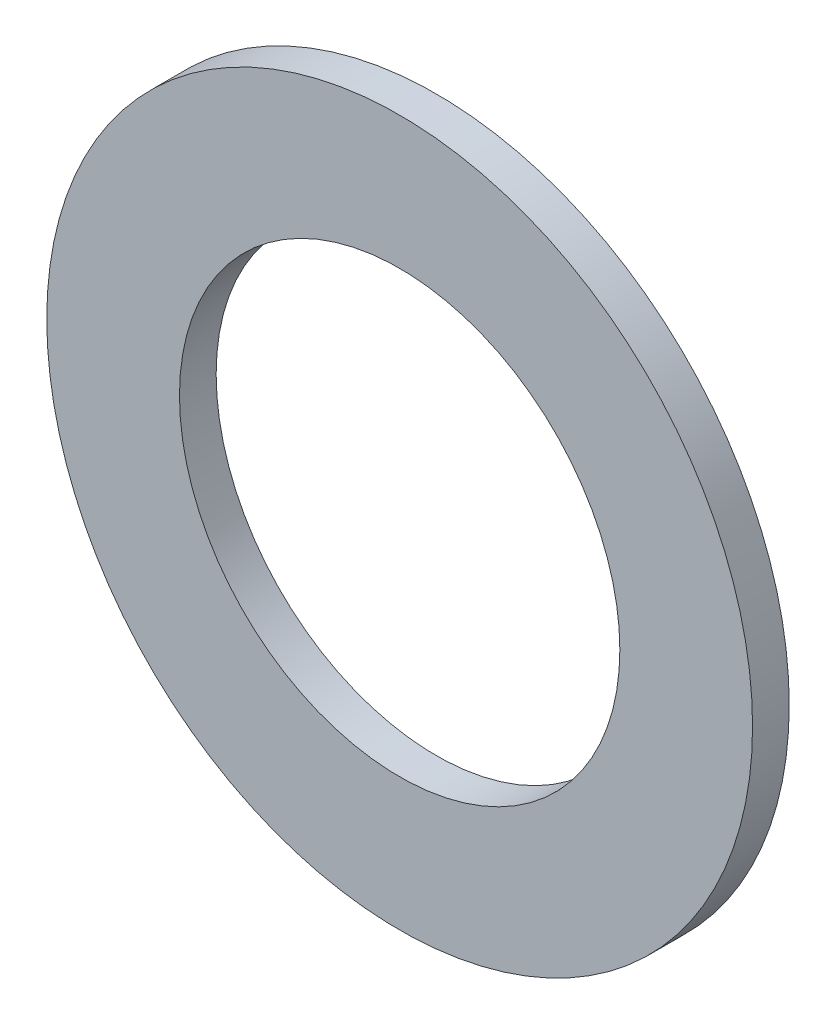
ISO-10303-21;
HEADER;
FILE_DESCRIPTION(('STEP AP214'),'2;1');
FILE_NAME('part.step','',(''),(''),'','','');
FILE_SCHEMA(('AUTOMOTIVE_DESIGN { 1 0 10303 214 1 1 1 1 }'));
ENDSEC;
DATA;
#1=APPLICATION_CONTEXT('core data for automotive mechanical design processes');
#2=APPLICATION_PROTOCOL_DEFINITION('international standard','automotive_design',2000,#1);
#3=PRODUCT_CONTEXT('',#1,'mechanical');
#4=PRODUCT('Part','Part','',(#3));
#5=PRODUCT_RELATED_PRODUCT_CATEGORY('part','',(#4));
#6=PRODUCT_DEFINITION_FORMATION('','',#4);
#7=PRODUCT_DEFINITION_CONTEXT('part definition',#1,'design');
#8=PRODUCT_DEFINITION('design','',#6,#7);
#9=PRODUCT_DEFINITION_SHAPE('','',#8);
#10=(LENGTH_UNIT() NAMED_UNIT(*) SI_UNIT(.MILLI.,.METRE.));
#11=(NAMED_UNIT(*) PLANE_ANGLE_UNIT() SI_UNIT($,.RADIAN.));
#12=(NAMED_UNIT(*) SI_UNIT($,.STERADIAN.) SOLID_ANGLE_UNIT());
#13=UNCERTAINTY_MEASURE_WITH_UNIT(LENGTH_MEASURE(1.E-05),#10,'distance_accuracy_value','');
#14=(GEOMETRIC_REPRESENTATION_CONTEXT(3) GLOBAL_UNCERTAINTY_ASSIGNED_CONTEXT((#13)) GLOBAL_UNIT_ASSIGNED_CONTEXT((#10,
#11,#12)) REPRESENTATION_CONTEXT('',''));
#15=CARTESIAN_POINT('',(0.,0.,0.));
#16=DIRECTION('',(0.,0.,1.));
#17=DIRECTION('',(1.,0.,0.));
#18=AXIS2_PLACEMENT_3D('',#15,#16,#17);
#19=CARTESIAN_POINT('',(0.,0.,0.33));
#20=DIRECTION('',(0.,0.,-1.));
#21=DIRECTION('',(-1.,0.,0.));
#22=AXIS2_PLACEMENT_3D('',#19,#20,#21);
#23=CYLINDRICAL_SURFACE('',#22,3.175);
#24=CARTESIAN_POINT('',(0.,0.,0.33));
#25=DIRECTION('',(0.,0.,-1.));
#26=DIRECTION('',(-1.,0.,0.));
#27=AXIS2_PLACEMENT_3D('',#24,#25,#26);
#28=CIRCLE('',#27,3.175);
#29=CARTESIAN_POINT('',(-3.175,0.,0.33));
#30=VERTEX_POINT('',#29);
#31=EDGE_CURVE('E19',#30,#30,#28,.F.);
#32=ORIENTED_EDGE('',*,*,#31,.F.);
#33=EDGE_LOOP('',(#32));
#34=FACE_BOUND('',#33,.T.);
#35=CARTESIAN_POINT('',(0.,0.,0.));
#36=DIRECTION('',(0.,0.,-1.));
#37=DIRECTION('',(-1.,0.,0.));
#38=AXIS2_PLACEMENT_3D('',#35,#36,#37);
#39=CIRCLE('',#38,3.175);
#40=CARTESIAN_POINT('',(-3.175,0.,0.));
#41=VERTEX_POINT('',#40);
#42=EDGE_CURVE('E28',#41,#41,#39,.F.);
#43=ORIENTED_EDGE('',*,*,#42,.T.);
#44=EDGE_LOOP('',(#43));
#45=FACE_BOUND('',#44,.T.);
#46=ADVANCED_FACE('F15',(#34,#45),#23,.T.);
#47=CARTESIAN_POINT('',(-3.2131,-3.2131,0.33));
#48=DIRECTION('',(0.,0.,1.));
#49=DIRECTION('',(1.,0.,0.));
#50=AXIS2_PLACEMENT_3D('',#47,#48,#49);
#51=PLANE('',#50);
#52=CARTESIAN_POINT('',(0.,0.,0.33));
#53=DIRECTION('',(0.,0.,-1.));
#54=DIRECTION('',(-1.,0.,0.));
#55=AXIS2_PLACEMENT_3D('',#52,#53,#54);
#56=CIRCLE('',#55,1.981);
#57=CARTESIAN_POINT('',(-1.981,0.,0.33));
#58=VERTEX_POINT('',#57);
#59=EDGE_CURVE('E23',#58,#58,#56,.F.);
#60=ORIENTED_EDGE('',*,*,#59,.F.);
#61=EDGE_LOOP('',(#60));
#62=FACE_BOUND('',#61,.T.);
#63=ORIENTED_EDGE('',*,*,#31,.T.);
#64=EDGE_LOOP('',(#63));
#65=FACE_BOUND('',#64,.T.);
#66=ADVANCED_FACE('F36',(#62,#65),#51,.T.);
#67=CARTESIAN_POINT('',(-3.2131,-3.2131,0.));
#68=DIRECTION('',(0.,0.,1.));
#69=DIRECTION('',(1.,0.,0.));
#70=AXIS2_PLACEMENT_3D('',#67,#68,#69);
#71=PLANE('',#70);
#72=CARTESIAN_POINT('',(0.,0.,0.));
#73=DIRECTION('',(0.,0.,-1.));
#74=DIRECTION('',(-1.,0.,0.));
#75=AXIS2_PLACEMENT_3D('',#72,#73,#74);
#76=CIRCLE('',#75,1.981);
#77=CARTESIAN_POINT('',(-1.981,0.,0.));
#78=VERTEX_POINT('',#77);
#79=EDGE_CURVE('E10',#78,#78,#76,.T.);
#80=ORIENTED_EDGE('',*,*,#79,.F.);
#81=EDGE_LOOP('',(#80));
#82=FACE_BOUND('',#81,.T.);
#83=ORIENTED_EDGE('',*,*,#42,.F.);
#84=EDGE_LOOP('',(#83));
#85=FACE_BOUND('',#84,.T.);
#86=ADVANCED_FACE('F17',(#82,#85),#71,.F.);
#87=CARTESIAN_POINT('',(0.,0.,0.33));
#88=DIRECTION('',(0.,0.,-1.));
#89=DIRECTION('',(-1.,0.,0.));
#90=AXIS2_PLACEMENT_3D('',#87,#88,#89);
#91=CYLINDRICAL_SURFACE('',#90,1.981);
#92=ORIENTED_EDGE('',*,*,#59,.T.);
#93=EDGE_LOOP('',(#92));
#94=FACE_BOUND('',#93,.T.);
#95=ORIENTED_EDGE('',*,*,#79,.T.);
#96=EDGE_LOOP('',(#95));
#97=FACE_BOUND('',#96,.T.);
#98=ADVANCED_FACE('F46',(#94,#97),#91,.F.);
#99=CLOSED_SHELL('',(#46,#66,#86,#98));
#100=MANIFOLD_SOLID_BREP('B1',#99);
#101=ADVANCED_BREP_SHAPE_REPRESENTATION('',(#18,#100),#14);
#102=SHAPE_DEFINITION_REPRESENTATION(#9,#101);
ENDSEC;
END-ISO-10303-21;
